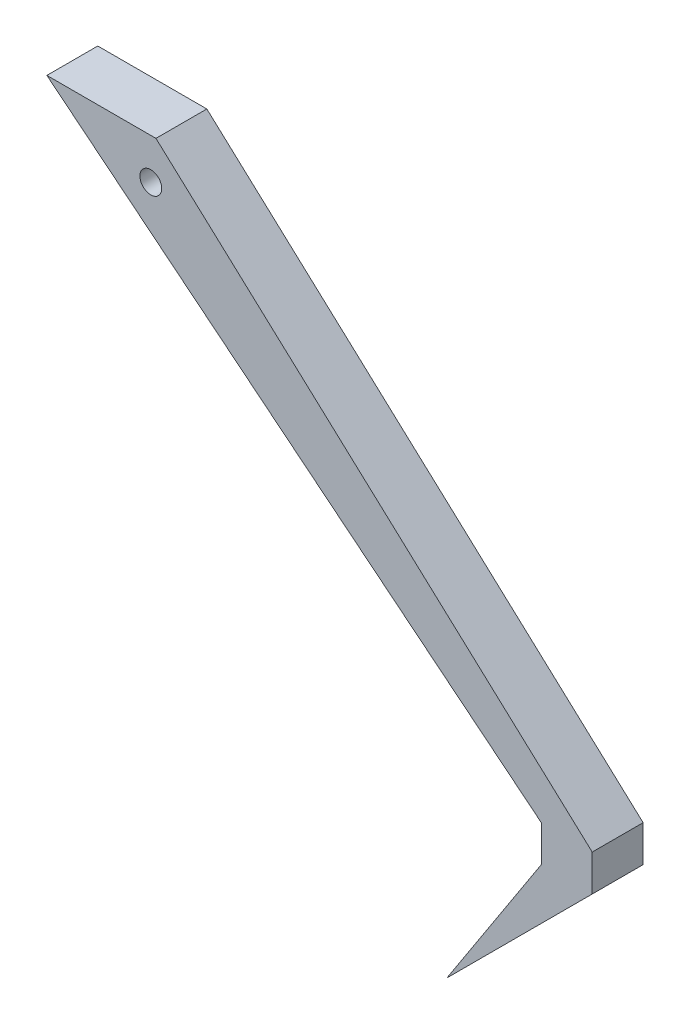
ISO-10303-21;
HEADER;
FILE_DESCRIPTION(('STEP AP214'),'2;1');
FILE_NAME('part.step','',(''),(''),'','','');
FILE_SCHEMA(('AUTOMOTIVE_DESIGN { 1 0 10303 214 1 1 1 1 }'));
ENDSEC;
DATA;
#1=APPLICATION_CONTEXT('core data for automotive mechanical design processes');
#2=APPLICATION_PROTOCOL_DEFINITION('international standard','automotive_design',2000,#1);
#3=PRODUCT_CONTEXT('',#1,'mechanical');
#4=PRODUCT('Part','Part','',(#3));
#5=PRODUCT_RELATED_PRODUCT_CATEGORY('part','',(#4));
#6=PRODUCT_DEFINITION_FORMATION('','',#4);
#7=PRODUCT_DEFINITION_CONTEXT('part definition',#1,'design');
#8=PRODUCT_DEFINITION('design','',#6,#7);
#9=PRODUCT_DEFINITION_SHAPE('','',#8);
#10=(LENGTH_UNIT() NAMED_UNIT(*) SI_UNIT(.MILLI.,.METRE.));
#11=(NAMED_UNIT(*) PLANE_ANGLE_UNIT() SI_UNIT($,.RADIAN.));
#12=(NAMED_UNIT(*) SI_UNIT($,.STERADIAN.) SOLID_ANGLE_UNIT());
#13=UNCERTAINTY_MEASURE_WITH_UNIT(LENGTH_MEASURE(1.E-05),#10,'distance_accuracy_value','');
#14=(GEOMETRIC_REPRESENTATION_CONTEXT(3) GLOBAL_UNCERTAINTY_ASSIGNED_CONTEXT((#13)) GLOBAL_UNIT_ASSIGNED_CONTEXT((#10,
#11,#12)) REPRESENTATION_CONTEXT('',''));
#15=CARTESIAN_POINT('',(0.,0.,0.));
#16=DIRECTION('',(0.,0.,1.));
#17=DIRECTION('',(1.,0.,0.));
#18=AXIS2_PLACEMENT_3D('',#15,#16,#17);
#19=CARTESIAN_POINT('',(60.,-60.,7.));
#20=DIRECTION('',(0.707106781186548,-0.707106781186547,0.));
#21=DIRECTION('',(0.707106781186547,0.707106781186548,0.));
#22=AXIS2_PLACEMENT_3D('',#19,#20,#21);
#23=PLANE('',#22);
#24=DIRECTION('',(-0.707106781186547,-0.707106781186548,0.));
#25=VECTOR('',#24,1.);
#26=CARTESIAN_POINT('',(60.,-60.,0.));
#27=LINE('',#26,#25);
#28=CARTESIAN_POINT('',(60.,-60.,0.));
#29=VERTEX_POINT('',#28);
#30=CARTESIAN_POINT('',(40.,-80.,0.));
#31=VERTEX_POINT('',#30);
#32=EDGE_CURVE('E140',#29,#31,#27,.T.);
#33=ORIENTED_EDGE('',*,*,#32,.F.);
#34=DIRECTION('',(0.,0.,-1.));
#35=VECTOR('',#34,1.);
#36=CARTESIAN_POINT('',(60.,-60.,7.));
#37=LINE('',#36,#35);
#38=CARTESIAN_POINT('',(60.,-60.,7.));
#39=VERTEX_POINT('',#38);
#40=EDGE_CURVE('E11',#39,#29,#37,.T.);
#41=ORIENTED_EDGE('',*,*,#40,.F.);
#42=DIRECTION('',(-0.707106781186547,-0.707106781186548,0.));
#43=VECTOR('',#42,1.);
#44=CARTESIAN_POINT('',(60.,-60.,7.));
#45=LINE('',#44,#43);
#46=CARTESIAN_POINT('',(40.,-80.,7.));
#47=VERTEX_POINT('',#46);
#48=EDGE_CURVE('E164',#39,#47,#45,.T.);
#49=ORIENTED_EDGE('',*,*,#48,.T.);
#50=DIRECTION('',(0.,0.,-1.));
#51=VECTOR('',#50,1.);
#52=CARTESIAN_POINT('',(40.,-80.,7.));
#53=LINE('',#52,#51);
#54=EDGE_CURVE('E97',#47,#31,#53,.T.);
#55=ORIENTED_EDGE('',*,*,#54,.T.);
#56=EDGE_LOOP('',(#33,#41,#49,#55));
#57=FACE_BOUND('',#56,.T.);
#58=ADVANCED_FACE('F43',(#57),#23,.T.);
#59=CARTESIAN_POINT('',(60.,-55.,7.));
#60=DIRECTION('',(1.,0.,0.));
#61=DIRECTION('',(0.,0.,-1.));
#62=AXIS2_PLACEMENT_3D('',#59,#60,#61);
#63=PLANE('',#62);
#64=DIRECTION('',(0.,-1.,0.));
#65=VECTOR('',#64,1.);
#66=CARTESIAN_POINT('',(60.,-55.,0.));
#67=LINE('',#66,#65);
#68=CARTESIAN_POINT('',(60.,-55.,0.));
#69=VERTEX_POINT('',#68);
#70=EDGE_CURVE('E161',#69,#29,#67,.T.);
#71=ORIENTED_EDGE('',*,*,#70,.F.);
#72=DIRECTION('',(0.,0.,-1.));
#73=VECTOR('',#72,1.);
#74=CARTESIAN_POINT('',(60.,-55.,7.));
#75=LINE('',#74,#73);
#76=CARTESIAN_POINT('',(60.,-55.,7.));
#77=VERTEX_POINT('',#76);
#78=EDGE_CURVE('E53',#77,#69,#75,.T.);
#79=ORIENTED_EDGE('',*,*,#78,.F.);
#80=DIRECTION('',(0.,-1.,0.));
#81=VECTOR('',#80,1.);
#82=CARTESIAN_POINT('',(60.,-55.,7.));
#83=LINE('',#82,#81);
#84=EDGE_CURVE('E125',#77,#39,#83,.T.);
#85=ORIENTED_EDGE('',*,*,#84,.T.);
#86=ORIENTED_EDGE('',*,*,#40,.T.);
#87=EDGE_LOOP('',(#71,#79,#85,#86));
#88=FACE_BOUND('',#87,.T.);
#89=ADVANCED_FACE('F182',(#88),#63,.T.);
#90=CARTESIAN_POINT('',(0.,0.,7.));
#91=DIRECTION('',(0.675724628517346,0.737154140200741,0.));
#92=DIRECTION('',(-0.737154140200741,0.675724628517346,0.));
#93=AXIS2_PLACEMENT_3D('',#90,#91,#92);
#94=PLANE('',#93);
#95=DIRECTION('',(0.737154140200741,-0.675724628517346,0.));
#96=VECTOR('',#95,1.);
#97=CARTESIAN_POINT('',(0.,0.,0.));
#98=LINE('',#97,#96);
#99=CARTESIAN_POINT('',(0.,0.,0.));
#100=VERTEX_POINT('',#99);
#101=EDGE_CURVE('E113',#100,#69,#98,.T.);
#102=ORIENTED_EDGE('',*,*,#101,.F.);
#103=DIRECTION('',(0.,0.,-1.));
#104=VECTOR('',#103,1.);
#105=CARTESIAN_POINT('',(0.,0.,7.));
#106=LINE('',#105,#104);
#107=CARTESIAN_POINT('',(0.,0.,7.));
#108=VERTEX_POINT('',#107);
#109=EDGE_CURVE('E108',#108,#100,#106,.T.);
#110=ORIENTED_EDGE('',*,*,#109,.F.);
#111=DIRECTION('',(0.737154140200741,-0.675724628517346,0.));
#112=VECTOR('',#111,1.);
#113=CARTESIAN_POINT('',(0.,0.,7.));
#114=LINE('',#113,#112);
#115=EDGE_CURVE('E111',#108,#77,#114,.T.);
#116=ORIENTED_EDGE('',*,*,#115,.T.);
#117=ORIENTED_EDGE('',*,*,#78,.T.);
#118=EDGE_LOOP('',(#102,#110,#116,#117));
#119=FACE_BOUND('',#118,.T.);
#120=ADVANCED_FACE('F110',(#119),#94,.T.);
#121=CARTESIAN_POINT('',(-15.,0.,7.));
#122=DIRECTION('',(0.,1.,0.));
#123=DIRECTION('',(-1.,0.,0.));
#124=AXIS2_PLACEMENT_3D('',#121,#122,#123);
#125=PLANE('',#124);
#126=DIRECTION('',(1.,0.,0.));
#127=VECTOR('',#126,1.);
#128=CARTESIAN_POINT('',(-15.,0.,0.));
#129=LINE('',#128,#127);
#130=CARTESIAN_POINT('',(-15.,0.,0.));
#131=VERTEX_POINT('',#130);
#132=EDGE_CURVE('E156',#131,#100,#129,.T.);
#133=ORIENTED_EDGE('',*,*,#132,.F.);
#134=DIRECTION('',(0.,0.,-1.));
#135=VECTOR('',#134,1.);
#136=CARTESIAN_POINT('',(-15.,0.,7.));
#137=LINE('',#136,#135);
#138=CARTESIAN_POINT('',(-15.,0.,7.));
#139=VERTEX_POINT('',#138);
#140=EDGE_CURVE('E119',#139,#131,#137,.T.);
#141=ORIENTED_EDGE('',*,*,#140,.F.);
#142=DIRECTION('',(1.,0.,0.));
#143=VECTOR('',#142,1.);
#144=CARTESIAN_POINT('',(-15.,0.,7.));
#145=LINE('',#144,#143);
#146=EDGE_CURVE('E124',#139,#108,#145,.T.);
#147=ORIENTED_EDGE('',*,*,#146,.T.);
#148=ORIENTED_EDGE('',*,*,#109,.T.);
#149=EDGE_LOOP('',(#133,#141,#147,#148));
#150=FACE_BOUND('',#149,.T.);
#151=ADVANCED_FACE('F128',(#150),#125,.T.);
#152=CARTESIAN_POINT('',(-15.,0.,7.));
#153=DIRECTION('',(0.628869249431164,0.777511072023984,0.));
#154=DIRECTION('',(-0.777511072023984,0.628869249431164,0.));
#155=AXIS2_PLACEMENT_3D('',#152,#153,#154);
#156=PLANE('',#155);
#157=DIRECTION('',(0.777511072023984,-0.628869249431164,0.));
#158=VECTOR('',#157,1.);
#159=CARTESIAN_POINT('',(-15.,0.,0.));
#160=LINE('',#159,#158);
#161=CARTESIAN_POINT('',(53.,-55.,0.));
#162=VERTEX_POINT('',#161);
#163=EDGE_CURVE('E153',#131,#162,#160,.T.);
#164=ORIENTED_EDGE('',*,*,#163,.T.);
#165=DIRECTION('',(0.,0.,-1.));
#166=VECTOR('',#165,1.);
#167=CARTESIAN_POINT('',(53.,-55.,7.));
#168=LINE('',#167,#166);
#169=CARTESIAN_POINT('',(53.,-55.,7.));
#170=VERTEX_POINT('',#169);
#171=EDGE_CURVE('E170',#170,#162,#168,.T.);
#172=ORIENTED_EDGE('',*,*,#171,.F.);
#173=DIRECTION('',(0.777511072023984,-0.628869249431164,0.));
#174=VECTOR('',#173,1.);
#175=CARTESIAN_POINT('',(-15.,0.,7.));
#176=LINE('',#175,#174);
#177=EDGE_CURVE('E131',#139,#170,#176,.T.);
#178=ORIENTED_EDGE('',*,*,#177,.F.);
#179=ORIENTED_EDGE('',*,*,#140,.T.);
#180=EDGE_LOOP('',(#164,#172,#178,#179));
#181=FACE_BOUND('',#180,.T.);
#182=ADVANCED_FACE('F195',(#181),#156,.F.);
#183=CARTESIAN_POINT('',(53.,-55.,7.));
#184=DIRECTION('',(1.,0.,0.));
#185=DIRECTION('',(0.,1.,0.));
#186=AXIS2_PLACEMENT_3D('',#183,#184,#185);
#187=PLANE('',#186);
#188=DIRECTION('',(0.,-1.,0.));
#189=VECTOR('',#188,1.);
#190=CARTESIAN_POINT('',(53.,-55.,0.));
#191=LINE('',#190,#189);
#192=CARTESIAN_POINT('',(53.,-60.,0.));
#193=VERTEX_POINT('',#192);
#194=EDGE_CURVE('E149',#162,#193,#191,.T.);
#195=ORIENTED_EDGE('',*,*,#194,.T.);
#196=DIRECTION('',(0.,0.,-1.));
#197=VECTOR('',#196,1.);
#198=CARTESIAN_POINT('',(53.,-60.,7.));
#199=LINE('',#198,#197);
#200=CARTESIAN_POINT('',(53.,-60.,7.));
#201=VERTEX_POINT('',#200);
#202=EDGE_CURVE('E174',#201,#193,#199,.T.);
#203=ORIENTED_EDGE('',*,*,#202,.F.);
#204=DIRECTION('',(0.,-1.,0.));
#205=VECTOR('',#204,1.);
#206=CARTESIAN_POINT('',(53.,-55.,7.));
#207=LINE('',#206,#205);
#208=EDGE_CURVE('E134',#170,#201,#207,.T.);
#209=ORIENTED_EDGE('',*,*,#208,.F.);
#210=ORIENTED_EDGE('',*,*,#171,.T.);
#211=EDGE_LOOP('',(#195,#203,#209,#210));
#212=FACE_BOUND('',#211,.T.);
#213=ADVANCED_FACE('F198',(#212),#187,.F.);
#214=CARTESIAN_POINT('',(40.,-80.,7.));
#215=DIRECTION('',(-0.838443616300637,0.544988350595414,0.));
#216=DIRECTION('',(-0.544988350595414,-0.838443616300637,0.));
#217=AXIS2_PLACEMENT_3D('',#214,#215,#216);
#218=PLANE('',#217);
#219=DIRECTION('',(0.544988350595414,0.838443616300637,0.));
#220=VECTOR('',#219,1.);
#221=CARTESIAN_POINT('',(40.,-80.,0.));
#222=LINE('',#221,#220);
#223=EDGE_CURVE('E144',#31,#193,#222,.T.);
#224=ORIENTED_EDGE('',*,*,#223,.F.);
#225=ORIENTED_EDGE('',*,*,#54,.F.);
#226=DIRECTION('',(0.544988350595414,0.838443616300637,0.));
#227=VECTOR('',#226,1.);
#228=CARTESIAN_POINT('',(40.,-80.,7.));
#229=LINE('',#228,#227);
#230=EDGE_CURVE('E228',#47,#201,#229,.T.);
#231=ORIENTED_EDGE('',*,*,#230,.T.);
#232=ORIENTED_EDGE('',*,*,#202,.T.);
#233=EDGE_LOOP('',(#224,#225,#231,#232));
#234=FACE_BOUND('',#233,.T.);
#235=ADVANCED_FACE('F177',(#234),#218,.T.);
#236=CARTESIAN_POINT('',(0.,0.,7.));
#237=DIRECTION('',(0.,0.,1.));
#238=DIRECTION('',(1.,0.,0.));
#239=AXIS2_PLACEMENT_3D('',#236,#237,#238);
#240=PLANE('',#239);
#241=CARTESIAN_POINT('',(-0.705610521143513,-5.58206324147703,7.));
#242=DIRECTION('',(0.,0.,1.));
#243=DIRECTION('',(1.,0.,0.));
#244=AXIS2_PLACEMENT_3D('',#241,#242,#243);
#245=CIRCLE('',#244,1.5);
#246=CARTESIAN_POINT('',(0.794389478856488,-5.58206324147703,7.));
#247=VERTEX_POINT('',#246);
#248=EDGE_CURVE('E145',#247,#247,#245,.T.);
#249=ORIENTED_EDGE('',*,*,#248,.F.);
#250=EDGE_LOOP('',(#249));
#251=FACE_BOUND('',#250,.T.);
#252=ORIENTED_EDGE('',*,*,#48,.F.);
#253=ORIENTED_EDGE('',*,*,#84,.F.);
#254=ORIENTED_EDGE('',*,*,#115,.F.);
#255=ORIENTED_EDGE('',*,*,#146,.F.);
#256=ORIENTED_EDGE('',*,*,#177,.T.);
#257=ORIENTED_EDGE('',*,*,#208,.T.);
#258=ORIENTED_EDGE('',*,*,#230,.F.);
#259=EDGE_LOOP('',(#252,#253,#254,#255,#256,#257,#258));
#260=FACE_BOUND('',#259,.T.);
#261=ADVANCED_FACE('F123',(#251,#260),#240,.T.);
#262=CARTESIAN_POINT('',(0.,0.,0.));
#263=DIRECTION('',(0.,0.,1.));
#264=DIRECTION('',(1.,0.,0.));
#265=AXIS2_PLACEMENT_3D('',#262,#263,#264);
#266=PLANE('',#265);
#267=CARTESIAN_POINT('',(-0.705610521143513,-5.58206324147703,0.));
#268=DIRECTION('',(0.,0.,1.));
#269=DIRECTION('',(1.,0.,0.));
#270=AXIS2_PLACEMENT_3D('',#267,#268,#269);
#271=CIRCLE('',#270,1.5);
#272=CARTESIAN_POINT('',(0.794389478856488,-5.58206324147703,0.));
#273=VERTEX_POINT('',#272);
#274=EDGE_CURVE('E46',#273,#273,#271,.T.);
#275=ORIENTED_EDGE('',*,*,#274,.T.);
#276=EDGE_LOOP('',(#275));
#277=FACE_BOUND('',#276,.T.);
#278=ORIENTED_EDGE('',*,*,#32,.T.);
#279=ORIENTED_EDGE('',*,*,#223,.T.);
#280=ORIENTED_EDGE('',*,*,#194,.F.);
#281=ORIENTED_EDGE('',*,*,#163,.F.);
#282=ORIENTED_EDGE('',*,*,#132,.T.);
#283=ORIENTED_EDGE('',*,*,#101,.T.);
#284=ORIENTED_EDGE('',*,*,#70,.T.);
#285=EDGE_LOOP('',(#278,#279,#280,#281,#282,#283,#284));
#286=FACE_BOUND('',#285,.T.);
#287=ADVANCED_FACE('F181',(#277,#286),#266,.F.);
#288=CARTESIAN_POINT('',(-0.705610521143513,-5.58206324147703,-0.5));
#289=DIRECTION('',(0.,0.,1.));
#290=DIRECTION('',(1.,0.,0.));
#291=AXIS2_PLACEMENT_3D('',#288,#289,#290);
#292=CYLINDRICAL_SURFACE('',#291,1.5);
#293=ORIENTED_EDGE('',*,*,#248,.T.);
#294=EDGE_LOOP('',(#293));
#295=FACE_BOUND('',#294,.T.);
#296=ORIENTED_EDGE('',*,*,#274,.F.);
#297=EDGE_LOOP('',(#296));
#298=FACE_BOUND('',#297,.T.);
#299=ADVANCED_FACE('F210',(#295,#298),#292,.F.);
#300=CLOSED_SHELL('',(#58,#89,#120,#151,#182,#213,#235,#261,#287,#299));
#301=MANIFOLD_SOLID_BREP('B2',#300);
#302=ADVANCED_BREP_SHAPE_REPRESENTATION('',(#18,#301),#14);
#303=SHAPE_DEFINITION_REPRESENTATION(#9,#302);
ENDSEC;
END-ISO-10303-21;
